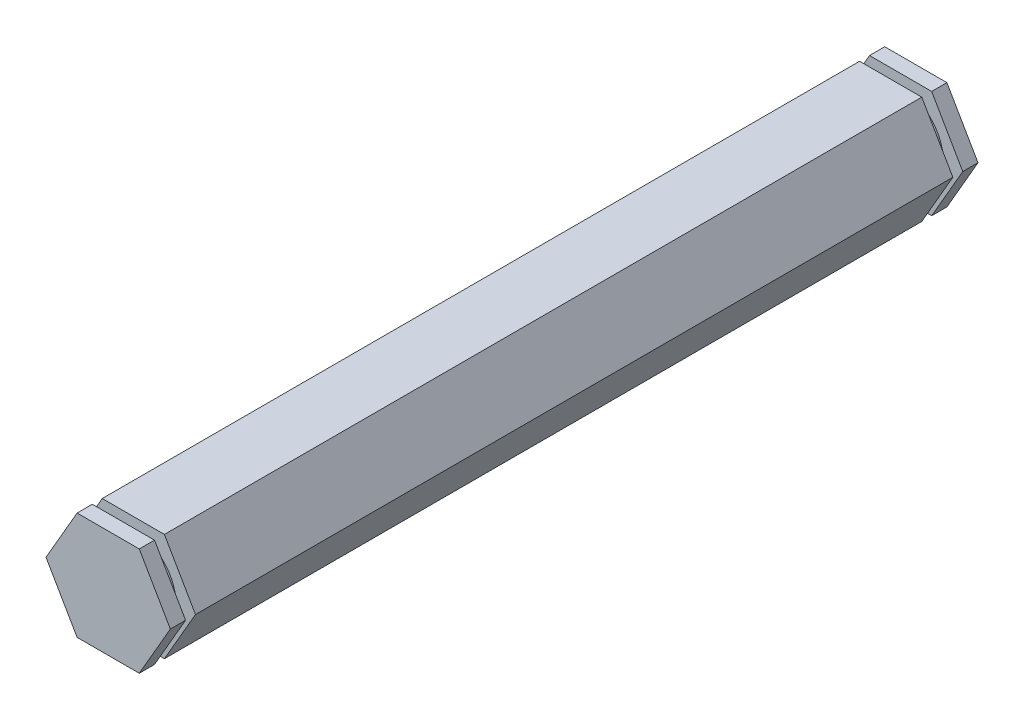
ISO-10303-21;
HEADER;
FILE_DESCRIPTION(('STEP AP214'),'2;1');
FILE_NAME('part.step','',(''),(''),'','','');
FILE_SCHEMA(('AUTOMOTIVE_DESIGN { 1 0 10303 214 1 1 1 1 }'));
ENDSEC;
DATA;
#1=APPLICATION_CONTEXT('core data for automotive mechanical design processes');
#2=APPLICATION_PROTOCOL_DEFINITION('international standard','automotive_design',2000,#1);
#3=PRODUCT_CONTEXT('',#1,'mechanical');
#4=PRODUCT('Part','Part','',(#3));
#5=PRODUCT_RELATED_PRODUCT_CATEGORY('part','',(#4));
#6=PRODUCT_DEFINITION_FORMATION('','',#4);
#7=PRODUCT_DEFINITION_CONTEXT('part definition',#1,'design');
#8=PRODUCT_DEFINITION('design','',#6,#7);
#9=PRODUCT_DEFINITION_SHAPE('','',#8);
#10=(LENGTH_UNIT() NAMED_UNIT(*) SI_UNIT(.MILLI.,.METRE.));
#11=(NAMED_UNIT(*) PLANE_ANGLE_UNIT() SI_UNIT($,.RADIAN.));
#12=(NAMED_UNIT(*) SI_UNIT($,.STERADIAN.) SOLID_ANGLE_UNIT());
#13=UNCERTAINTY_MEASURE_WITH_UNIT(LENGTH_MEASURE(1.E-05),#10,'distance_accuracy_value','');
#14=(GEOMETRIC_REPRESENTATION_CONTEXT(3) GLOBAL_UNCERTAINTY_ASSIGNED_CONTEXT((#13)) GLOBAL_UNIT_ASSIGNED_CONTEXT((#10,
#11,#12)) REPRESENTATION_CONTEXT('',''));
#15=CARTESIAN_POINT('',(0.,0.,0.));
#16=DIRECTION('',(0.,0.,1.));
#17=DIRECTION('',(1.,0.,0.));
#18=AXIS2_PLACEMENT_3D('',#15,#16,#17);
#19=CARTESIAN_POINT('',(3.66617420935412,6.35,47.625));
#20=DIRECTION('',(0.,-1.,0.));
#21=DIRECTION('',(0.,0.,-1.));
#22=AXIS2_PLACEMENT_3D('',#19,#20,#21);
#23=PLANE('',#22);
#24=DIRECTION('',(0.,0.,-1.));
#25=VECTOR('',#24,1.);
#26=CARTESIAN_POINT('',(3.66617420935412,6.35,47.625));
#27=LINE('',#26,#25);
#28=CARTESIAN_POINT('',(3.66617420935412,6.35,47.625));
#29=VERTEX_POINT('',#28);
#30=CARTESIAN_POINT('',(3.66617420935412,6.35,45.82795));
#31=VERTEX_POINT('',#30);
#32=EDGE_CURVE('E178',#29,#31,#27,.T.);
#33=ORIENTED_EDGE('',*,*,#32,.T.);
#34=DIRECTION('',(-1.,0.,0.));
#35=VECTOR('',#34,1.);
#36=CARTESIAN_POINT('',(3.66617420935412,6.35,45.82795));
#37=LINE('',#36,#35);
#38=CARTESIAN_POINT('',(-3.66617420935412,6.35,45.82795));
#39=VERTEX_POINT('',#38);
#40=EDGE_CURVE('E225',#31,#39,#37,.T.);
#41=ORIENTED_EDGE('',*,*,#40,.T.);
#42=DIRECTION('',(0.,0.,-1.));
#43=VECTOR('',#42,1.);
#44=CARTESIAN_POINT('',(-3.66617420935412,6.35,47.625));
#45=LINE('',#44,#43);
#46=CARTESIAN_POINT('',(-3.66617420935412,6.35,47.625));
#47=VERTEX_POINT('',#46);
#48=EDGE_CURVE('E207',#47,#39,#45,.T.);
#49=ORIENTED_EDGE('',*,*,#48,.F.);
#50=DIRECTION('',(-1.,0.,0.));
#51=VECTOR('',#50,1.);
#52=CARTESIAN_POINT('',(3.66617420935412,6.35,47.625));
#53=LINE('',#52,#51);
#54=EDGE_CURVE('E227',#29,#47,#53,.T.);
#55=ORIENTED_EDGE('',*,*,#54,.F.);
#56=EDGE_LOOP('',(#33,#41,#49,#55));
#57=FACE_BOUND('',#56,.T.);
#58=ADVANCED_FACE('F35',(#57),#23,.F.);
#59=CARTESIAN_POINT('',(-3.66617420935412,6.35,47.625));
#60=DIRECTION('',(0.866025403784439,-0.499999999999999,0.));
#61=DIRECTION('',(0.499999999999999,0.866025403784439,0.));
#62=AXIS2_PLACEMENT_3D('',#59,#60,#61);
#63=PLANE('',#62);
#64=ORIENTED_EDGE('',*,*,#48,.T.);
#65=DIRECTION('',(-0.499999999999999,-0.866025403784439,0.));
#66=VECTOR('',#65,1.);
#67=CARTESIAN_POINT('',(-3.66617420935412,6.35,45.82795));
#68=LINE('',#67,#66);
#69=CARTESIAN_POINT('',(-7.33234841870824,0.,45.82795));
#70=VERTEX_POINT('',#69);
#71=EDGE_CURVE('E303',#39,#70,#68,.T.);
#72=ORIENTED_EDGE('',*,*,#71,.T.);
#73=DIRECTION('',(0.,0.,-1.));
#74=VECTOR('',#73,1.);
#75=CARTESIAN_POINT('',(-7.33234841870824,0.,47.625));
#76=LINE('',#75,#74);
#77=CARTESIAN_POINT('',(-7.33234841870824,0.,47.625));
#78=VERTEX_POINT('',#77);
#79=EDGE_CURVE('E202',#78,#70,#76,.T.);
#80=ORIENTED_EDGE('',*,*,#79,.F.);
#81=DIRECTION('',(-0.499999999999999,-0.866025403784439,0.));
#82=VECTOR('',#81,1.);
#83=CARTESIAN_POINT('',(-3.66617420935412,6.35,47.625));
#84=LINE('',#83,#82);
#85=EDGE_CURVE('E229',#47,#78,#84,.T.);
#86=ORIENTED_EDGE('',*,*,#85,.F.);
#87=EDGE_LOOP('',(#64,#72,#80,#86));
#88=FACE_BOUND('',#87,.T.);
#89=ADVANCED_FACE('F307',(#88),#63,.F.);
#90=CARTESIAN_POINT('',(-7.33234841870824,0.,47.625));
#91=DIRECTION('',(0.866025403784438,0.5,0.));
#92=DIRECTION('',(-0.5,0.866025403784438,0.));
#93=AXIS2_PLACEMENT_3D('',#90,#91,#92);
#94=PLANE('',#93);
#95=ORIENTED_EDGE('',*,*,#79,.T.);
#96=DIRECTION('',(0.5,-0.866025403784438,0.));
#97=VECTOR('',#96,1.);
#98=CARTESIAN_POINT('',(-7.33234841870824,0.,45.82795));
#99=LINE('',#98,#97);
#100=CARTESIAN_POINT('',(-3.66617420935412,-6.35,45.82795));
#101=VERTEX_POINT('',#100);
#102=EDGE_CURVE('E301',#70,#101,#99,.T.);
#103=ORIENTED_EDGE('',*,*,#102,.T.);
#104=DIRECTION('',(0.,0.,-1.));
#105=VECTOR('',#104,1.);
#106=CARTESIAN_POINT('',(-3.66617420935412,-6.35,47.625));
#107=LINE('',#106,#105);
#108=CARTESIAN_POINT('',(-3.66617420935412,-6.35,47.625));
#109=VERTEX_POINT('',#108);
#110=EDGE_CURVE('E197',#109,#101,#107,.T.);
#111=ORIENTED_EDGE('',*,*,#110,.F.);
#112=DIRECTION('',(0.5,-0.866025403784438,0.));
#113=VECTOR('',#112,1.);
#114=CARTESIAN_POINT('',(-7.33234841870824,0.,47.625));
#115=LINE('',#114,#113);
#116=EDGE_CURVE('E231',#78,#109,#115,.T.);
#117=ORIENTED_EDGE('',*,*,#116,.F.);
#118=EDGE_LOOP('',(#95,#103,#111,#117));
#119=FACE_BOUND('',#118,.T.);
#120=ADVANCED_FACE('F310',(#119),#94,.F.);
#121=CARTESIAN_POINT('',(-3.66617420935412,-6.35,47.625));
#122=DIRECTION('',(0.,1.,0.));
#123=DIRECTION('',(-1.,0.,0.));
#124=AXIS2_PLACEMENT_3D('',#121,#122,#123);
#125=PLANE('',#124);
#126=ORIENTED_EDGE('',*,*,#110,.T.);
#127=DIRECTION('',(1.,0.,0.));
#128=VECTOR('',#127,1.);
#129=CARTESIAN_POINT('',(-3.66617420935412,-6.35,45.82795));
#130=LINE('',#129,#128);
#131=CARTESIAN_POINT('',(3.66617420935412,-6.35,45.82795));
#132=VERTEX_POINT('',#131);
#133=EDGE_CURVE('E298',#101,#132,#130,.T.);
#134=ORIENTED_EDGE('',*,*,#133,.T.);
#135=DIRECTION('',(0.,0.,-1.));
#136=VECTOR('',#135,1.);
#137=CARTESIAN_POINT('',(3.66617420935412,-6.35,47.625));
#138=LINE('',#137,#136);
#139=CARTESIAN_POINT('',(3.66617420935412,-6.35,47.625));
#140=VERTEX_POINT('',#139);
#141=EDGE_CURVE('E192',#140,#132,#138,.T.);
#142=ORIENTED_EDGE('',*,*,#141,.F.);
#143=DIRECTION('',(1.,0.,0.));
#144=VECTOR('',#143,1.);
#145=CARTESIAN_POINT('',(-3.66617420935412,-6.35,47.625));
#146=LINE('',#145,#144);
#147=EDGE_CURVE('E239',#109,#140,#146,.T.);
#148=ORIENTED_EDGE('',*,*,#147,.F.);
#149=EDGE_LOOP('',(#126,#134,#142,#148));
#150=FACE_BOUND('',#149,.T.);
#151=ADVANCED_FACE('F317',(#150),#125,.F.);
#152=CARTESIAN_POINT('',(3.66617420935412,-6.35,47.625));
#153=DIRECTION('',(-0.866025403784439,0.5,0.));
#154=DIRECTION('',(-0.5,-0.866025403784439,0.));
#155=AXIS2_PLACEMENT_3D('',#152,#153,#154);
#156=PLANE('',#155);
#157=ORIENTED_EDGE('',*,*,#141,.T.);
#158=DIRECTION('',(0.5,0.866025403784439,0.));
#159=VECTOR('',#158,1.);
#160=CARTESIAN_POINT('',(3.66617420935412,-6.35,45.82795));
#161=LINE('',#160,#159);
#162=CARTESIAN_POINT('',(7.33234841870825,0.,45.82795));
#163=VERTEX_POINT('',#162);
#164=EDGE_CURVE('E296',#132,#163,#161,.T.);
#165=ORIENTED_EDGE('',*,*,#164,.T.);
#166=DIRECTION('',(0.,0.,-1.));
#167=VECTOR('',#166,1.);
#168=CARTESIAN_POINT('',(7.33234841870825,0.,47.625));
#169=LINE('',#168,#167);
#170=CARTESIAN_POINT('',(7.33234841870825,0.,47.625));
#171=VERTEX_POINT('',#170);
#172=EDGE_CURVE('E188',#171,#163,#169,.T.);
#173=ORIENTED_EDGE('',*,*,#172,.F.);
#174=DIRECTION('',(0.5,0.866025403784439,0.));
#175=VECTOR('',#174,1.);
#176=CARTESIAN_POINT('',(3.66617420935412,-6.35,47.625));
#177=LINE('',#176,#175);
#178=EDGE_CURVE('E241',#140,#171,#177,.T.);
#179=ORIENTED_EDGE('',*,*,#178,.F.);
#180=EDGE_LOOP('',(#157,#165,#173,#179));
#181=FACE_BOUND('',#180,.T.);
#182=ADVANCED_FACE('F319',(#181),#156,.F.);
#183=CARTESIAN_POINT('',(7.33234841870825,0.,47.625));
#184=DIRECTION('',(-0.866025403784438,-0.5,0.));
#185=DIRECTION('',(0.5,-0.866025403784438,0.));
#186=AXIS2_PLACEMENT_3D('',#183,#184,#185);
#187=PLANE('',#186);
#188=ORIENTED_EDGE('',*,*,#172,.T.);
#189=DIRECTION('',(-0.5,0.866025403784438,0.));
#190=VECTOR('',#189,1.);
#191=CARTESIAN_POINT('',(7.33234841870825,0.,45.82795));
#192=LINE('',#191,#190);
#193=EDGE_CURVE('E164',#163,#31,#192,.T.);
#194=ORIENTED_EDGE('',*,*,#193,.T.);
#195=ORIENTED_EDGE('',*,*,#32,.F.);
#196=DIRECTION('',(-0.5,0.866025403784438,0.));
#197=VECTOR('',#196,1.);
#198=CARTESIAN_POINT('',(7.33234841870825,0.,47.625));
#199=LINE('',#198,#197);
#200=EDGE_CURVE('E183',#171,#29,#199,.T.);
#201=ORIENTED_EDGE('',*,*,#200,.F.);
#202=EDGE_LOOP('',(#188,#194,#195,#201));
#203=FACE_BOUND('',#202,.T.);
#204=ADVANCED_FACE('F216',(#203),#187,.F.);
#205=CARTESIAN_POINT('',(0.,0.,47.625));
#206=DIRECTION('',(0.,0.,1.));
#207=DIRECTION('',(1.,0.,0.));
#208=AXIS2_PLACEMENT_3D('',#205,#206,#207);
#209=PLANE('',#208);
#210=ORIENTED_EDGE('',*,*,#54,.T.);
#211=ORIENTED_EDGE('',*,*,#85,.T.);
#212=ORIENTED_EDGE('',*,*,#116,.T.);
#213=ORIENTED_EDGE('',*,*,#147,.T.);
#214=ORIENTED_EDGE('',*,*,#178,.T.);
#215=ORIENTED_EDGE('',*,*,#200,.T.);
#216=EDGE_LOOP('',(#210,#211,#212,#213,#214,#215));
#217=FACE_BOUND('',#216,.T.);
#218=ADVANCED_FACE('F313',(#217),#209,.T.);
#219=CARTESIAN_POINT('',(0.,7.76239261253806,45.82795));
#220=DIRECTION('',(0.,0.,1.));
#221=DIRECTION('',(0.,-1.,0.));
#222=AXIS2_PLACEMENT_3D('',#219,#220,#221);
#223=PLANE('',#222);
#224=CARTESIAN_POINT('',(0.,0.,45.82795));
#225=DIRECTION('',(0.,0.,-1.));
#226=DIRECTION('',(0.,1.,0.));
#227=AXIS2_PLACEMENT_3D('',#224,#225,#226);
#228=CIRCLE('',#227,5.02919999999998);
#229=CARTESIAN_POINT('',(0.,5.0292,45.82795));
#230=VERTEX_POINT('',#229);
#231=EDGE_CURVE('E275',#230,#230,#228,.T.);
#232=ORIENTED_EDGE('',*,*,#231,.F.);
#233=EDGE_LOOP('',(#232));
#234=FACE_BOUND('',#233,.T.);
#235=ORIENTED_EDGE('',*,*,#193,.F.);
#236=ORIENTED_EDGE('',*,*,#164,.F.);
#237=ORIENTED_EDGE('',*,*,#133,.F.);
#238=ORIENTED_EDGE('',*,*,#102,.F.);
#239=ORIENTED_EDGE('',*,*,#71,.F.);
#240=ORIENTED_EDGE('',*,*,#40,.F.);
#241=EDGE_LOOP('',(#235,#236,#237,#238,#239,#240));
#242=FACE_BOUND('',#241,.T.);
#243=ADVANCED_FACE('F320',(#234,#242),#223,.F.);
#244=CARTESIAN_POINT('',(0.,5.0292,44.65955));
#245=DIRECTION('',(0.,0.,-1.));
#246=DIRECTION('',(0.,1.,0.));
#247=AXIS2_PLACEMENT_3D('',#244,#245,#246);
#248=PLANE('',#247);
#249=CARTESIAN_POINT('',(0.,0.,44.65955));
#250=DIRECTION('',(0.,0.,-1.));
#251=DIRECTION('',(0.,1.,0.));
#252=AXIS2_PLACEMENT_3D('',#249,#250,#251);
#253=CIRCLE('',#252,5.02919999999998);
#254=CARTESIAN_POINT('',(0.,5.0292,44.65955));
#255=VERTEX_POINT('',#254);
#256=EDGE_CURVE('E271',#255,#255,#253,.T.);
#257=ORIENTED_EDGE('',*,*,#256,.T.);
#258=EDGE_LOOP('',(#257));
#259=FACE_BOUND('',#258,.T.);
#260=DIRECTION('',(0.499999999999999,0.866025403784439,0.));
#261=VECTOR('',#260,1.);
#262=CARTESIAN_POINT('',(-3.66617420935412,6.35,44.65955));
#263=LINE('',#262,#261);
#264=CARTESIAN_POINT('',(-7.33234841870824,0.,44.65955));
#265=VERTEX_POINT('',#264);
#266=CARTESIAN_POINT('',(-3.66617420935412,6.35,44.65955));
#267=VERTEX_POINT('',#266);
#268=EDGE_CURVE('E292',#265,#267,#263,.T.);
#269=ORIENTED_EDGE('',*,*,#268,.F.);
#270=DIRECTION('',(-0.5,0.866025403784438,0.));
#271=VECTOR('',#270,1.);
#272=CARTESIAN_POINT('',(-7.33234841870824,0.,44.65955));
#273=LINE('',#272,#271);
#274=CARTESIAN_POINT('',(-3.66617420935412,-6.35,44.65955));
#275=VERTEX_POINT('',#274);
#276=EDGE_CURVE('E289',#275,#265,#273,.T.);
#277=ORIENTED_EDGE('',*,*,#276,.F.);
#278=DIRECTION('',(-1.,0.,0.));
#279=VECTOR('',#278,1.);
#280=CARTESIAN_POINT('',(-3.66617420935412,-6.35,44.65955));
#281=LINE('',#280,#279);
#282=CARTESIAN_POINT('',(3.66617420935412,-6.35,44.65955));
#283=VERTEX_POINT('',#282);
#284=EDGE_CURVE('E286',#283,#275,#281,.T.);
#285=ORIENTED_EDGE('',*,*,#284,.F.);
#286=DIRECTION('',(-0.5,-0.866025403784439,0.));
#287=VECTOR('',#286,1.);
#288=CARTESIAN_POINT('',(3.66617420935412,-6.35,44.65955));
#289=LINE('',#288,#287);
#290=CARTESIAN_POINT('',(7.33234841870825,0.,44.65955));
#291=VERTEX_POINT('',#290);
#292=EDGE_CURVE('E283',#291,#283,#289,.T.);
#293=ORIENTED_EDGE('',*,*,#292,.F.);
#294=DIRECTION('',(0.5,-0.866025403784438,0.));
#295=VECTOR('',#294,1.);
#296=CARTESIAN_POINT('',(7.33234841870825,0.,44.65955));
#297=LINE('',#296,#295);
#298=CARTESIAN_POINT('',(3.66617420935412,6.35,44.65955));
#299=VERTEX_POINT('',#298);
#300=EDGE_CURVE('E210',#299,#291,#297,.T.);
#301=ORIENTED_EDGE('',*,*,#300,.F.);
#302=DIRECTION('',(1.,0.,0.));
#303=VECTOR('',#302,1.);
#304=CARTESIAN_POINT('',(3.66617420935412,6.35,44.65955));
#305=LINE('',#304,#303);
#306=EDGE_CURVE('E177',#267,#299,#305,.T.);
#307=ORIENTED_EDGE('',*,*,#306,.F.);
#308=EDGE_LOOP('',(#269,#277,#285,#293,#301,#307));
#309=FACE_BOUND('',#308,.T.);
#310=ADVANCED_FACE('F322',(#259,#309),#248,.F.);
#311=CARTESIAN_POINT('',(0.,0.,0.));
#312=DIRECTION('',(0.,0.,-1.));
#313=DIRECTION('',(0.,1.,0.));
#314=AXIS2_PLACEMENT_3D('',#311,#312,#313);
#315=CYLINDRICAL_SURFACE('',#314,5.02919999999998);
#316=ORIENTED_EDGE('',*,*,#256,.F.);
#317=EDGE_LOOP('',(#316));
#318=FACE_BOUND('',#317,.T.);
#319=ORIENTED_EDGE('',*,*,#231,.T.);
#320=EDGE_LOOP('',(#319));
#321=FACE_BOUND('',#320,.T.);
#322=ADVANCED_FACE('F329',(#318,#321),#315,.T.);
#323=CARTESIAN_POINT('',(7.33234841870825,0.,-44.65955));
#324=VERTEX_POINT('',#323);
#325=EDGE_CURVE('E172',#291,#324,#169,.T.);
#326=ORIENTED_EDGE('',*,*,#325,.T.);
#327=DIRECTION('',(-0.5,0.866025403784438,0.));
#328=VECTOR('',#327,1.);
#329=CARTESIAN_POINT('',(7.33234841870823,0.,-44.65955));
#330=LINE('',#329,#328);
#331=CARTESIAN_POINT('',(3.66617420935412,6.35,-44.65955));
#332=VERTEX_POINT('',#331);
#333=EDGE_CURVE('E158',#324,#332,#330,.T.);
#334=ORIENTED_EDGE('',*,*,#333,.T.);
#335=EDGE_CURVE('E170',#299,#332,#27,.T.);
#336=ORIENTED_EDGE('',*,*,#335,.F.);
#337=ORIENTED_EDGE('',*,*,#300,.T.);
#338=EDGE_LOOP('',(#326,#334,#336,#337));
#339=FACE_BOUND('',#338,.T.);
#340=ADVANCED_FACE('F168',(#339),#187,.F.);
#341=CARTESIAN_POINT('',(3.66617420935412,-6.35,-44.65955));
#342=VERTEX_POINT('',#341);
#343=EDGE_CURVE('E196',#283,#342,#138,.T.);
#344=ORIENTED_EDGE('',*,*,#343,.T.);
#345=DIRECTION('',(0.5,0.866025403784439,0.));
#346=VECTOR('',#345,1.);
#347=CARTESIAN_POINT('',(3.66617420935414,-6.34999999999998,-44.65955));
#348=LINE('',#347,#346);
#349=EDGE_CURVE('E174',#342,#324,#348,.T.);
#350=ORIENTED_EDGE('',*,*,#349,.T.);
#351=ORIENTED_EDGE('',*,*,#325,.F.);
#352=ORIENTED_EDGE('',*,*,#292,.T.);
#353=EDGE_LOOP('',(#344,#350,#351,#352));
#354=FACE_BOUND('',#353,.T.);
#355=ADVANCED_FACE('F408',(#354),#156,.F.);
#356=CARTESIAN_POINT('',(-3.66617420935412,-6.35,-44.65955));
#357=VERTEX_POINT('',#356);
#358=EDGE_CURVE('E201',#275,#357,#107,.T.);
#359=ORIENTED_EDGE('',*,*,#358,.T.);
#360=DIRECTION('',(1.,0.,0.));
#361=VECTOR('',#360,1.);
#362=CARTESIAN_POINT('',(-3.66617420935412,-6.35,-44.65955));
#363=LINE('',#362,#361);
#364=EDGE_CURVE('E381',#357,#342,#363,.T.);
#365=ORIENTED_EDGE('',*,*,#364,.T.);
#366=ORIENTED_EDGE('',*,*,#343,.F.);
#367=ORIENTED_EDGE('',*,*,#284,.T.);
#368=EDGE_LOOP('',(#359,#365,#366,#367));
#369=FACE_BOUND('',#368,.T.);
#370=ADVANCED_FACE('F415',(#369),#125,.F.);
#371=CARTESIAN_POINT('',(-7.33234841870824,0.,-44.65955));
#372=VERTEX_POINT('',#371);
#373=EDGE_CURVE('E206',#265,#372,#76,.T.);
#374=ORIENTED_EDGE('',*,*,#373,.T.);
#375=DIRECTION('',(0.5,-0.866025403784438,0.));
#376=VECTOR('',#375,1.);
#377=CARTESIAN_POINT('',(-7.33234841870826,0.,-44.65955));
#378=LINE('',#377,#376);
#379=EDGE_CURVE('E365',#372,#357,#378,.T.);
#380=ORIENTED_EDGE('',*,*,#379,.T.);
#381=ORIENTED_EDGE('',*,*,#358,.F.);
#382=ORIENTED_EDGE('',*,*,#276,.T.);
#383=EDGE_LOOP('',(#374,#380,#381,#382));
#384=FACE_BOUND('',#383,.T.);
#385=ADVANCED_FACE('F362',(#384),#94,.F.);
#386=CARTESIAN_POINT('',(-3.66617420935412,6.35,-44.65955));
#387=VERTEX_POINT('',#386);
#388=EDGE_CURVE('E211',#267,#387,#45,.T.);
#389=ORIENTED_EDGE('',*,*,#388,.T.);
#390=DIRECTION('',(-0.499999999999999,-0.866025403784439,0.));
#391=VECTOR('',#390,1.);
#392=CARTESIAN_POINT('',(-3.66617420935411,6.35000000000002,-44.65955));
#393=LINE('',#392,#391);
#394=EDGE_CURVE('E57',#387,#372,#393,.T.);
#395=ORIENTED_EDGE('',*,*,#394,.T.);
#396=ORIENTED_EDGE('',*,*,#373,.F.);
#397=ORIENTED_EDGE('',*,*,#268,.T.);
#398=EDGE_LOOP('',(#389,#395,#396,#397));
#399=FACE_BOUND('',#398,.T.);
#400=ADVANCED_FACE('F340',(#399),#63,.F.);
#401=ORIENTED_EDGE('',*,*,#335,.T.);
#402=DIRECTION('',(-1.,0.,0.));
#403=VECTOR('',#402,1.);
#404=CARTESIAN_POINT('',(3.66617420935412,6.35,-44.65955));
#405=LINE('',#404,#403);
#406=EDGE_CURVE('E43',#332,#387,#405,.T.);
#407=ORIENTED_EDGE('',*,*,#406,.T.);
#408=ORIENTED_EDGE('',*,*,#388,.F.);
#409=ORIENTED_EDGE('',*,*,#306,.T.);
#410=EDGE_LOOP('',(#401,#407,#408,#409));
#411=FACE_BOUND('',#410,.T.);
#412=ADVANCED_FACE('F37',(#411),#23,.F.);
#413=CARTESIAN_POINT('',(0.,7.76239261253806,-45.82795));
#414=DIRECTION('',(0.,0.,-1.));
#415=DIRECTION('',(0.,-1.,0.));
#416=AXIS2_PLACEMENT_3D('',#413,#414,#415);
#417=PLANE('',#416);
#418=CARTESIAN_POINT('',(0.,0.,-45.82795));
#419=DIRECTION('',(0.,0.,-1.));
#420=DIRECTION('',(0.,1.,0.));
#421=AXIS2_PLACEMENT_3D('',#418,#419,#420);
#422=CIRCLE('',#421,5.02919999999998);
#423=CARTESIAN_POINT('',(0.,5.0292,-45.82795));
#424=VERTEX_POINT('',#423);
#425=EDGE_CURVE('E385',#424,#424,#422,.T.);
#426=ORIENTED_EDGE('',*,*,#425,.T.);
#427=EDGE_LOOP('',(#426));
#428=FACE_BOUND('',#427,.T.);
#429=DIRECTION('',(1.,0.,0.));
#430=VECTOR('',#429,1.);
#431=CARTESIAN_POINT('',(3.66617420935412,6.35,-45.82795));
#432=LINE('',#431,#430);
#433=CARTESIAN_POINT('',(-3.66617420935412,6.35,-45.82795));
#434=VERTEX_POINT('',#433);
#435=CARTESIAN_POINT('',(3.66617420935412,6.35,-45.82795));
#436=VERTEX_POINT('',#435);
#437=EDGE_CURVE('E11',#434,#436,#432,.T.);
#438=ORIENTED_EDGE('',*,*,#437,.F.);
#439=DIRECTION('',(0.499999999999999,0.866025403784439,0.));
#440=VECTOR('',#439,1.);
#441=CARTESIAN_POINT('',(-3.66617420935411,6.35000000000002,-45.82795));
#442=LINE('',#441,#440);
#443=CARTESIAN_POINT('',(-7.33234841870824,0.,-45.82795));
#444=VERTEX_POINT('',#443);
#445=EDGE_CURVE('E173',#444,#434,#442,.T.);
#446=ORIENTED_EDGE('',*,*,#445,.F.);
#447=DIRECTION('',(-0.5,0.866025403784438,0.));
#448=VECTOR('',#447,1.);
#449=CARTESIAN_POINT('',(-7.33234841870826,0.,-45.82795));
#450=LINE('',#449,#448);
#451=CARTESIAN_POINT('',(-3.66617420935412,-6.35,-45.82795));
#452=VERTEX_POINT('',#451);
#453=EDGE_CURVE('E376',#452,#444,#450,.T.);
#454=ORIENTED_EDGE('',*,*,#453,.F.);
#455=DIRECTION('',(-1.,0.,0.));
#456=VECTOR('',#455,1.);
#457=CARTESIAN_POINT('',(-3.66617420935412,-6.35,-45.82795));
#458=LINE('',#457,#456);
#459=CARTESIAN_POINT('',(3.66617420935412,-6.35,-45.82795));
#460=VERTEX_POINT('',#459);
#461=EDGE_CURVE('E277',#460,#452,#458,.T.);
#462=ORIENTED_EDGE('',*,*,#461,.F.);
#463=DIRECTION('',(-0.5,-0.866025403784439,0.));
#464=VECTOR('',#463,1.);
#465=CARTESIAN_POINT('',(3.66617420935414,-6.34999999999998,-45.82795));
#466=LINE('',#465,#464);
#467=CARTESIAN_POINT('',(7.33234841870825,0.,-45.82795));
#468=VERTEX_POINT('',#467);
#469=EDGE_CURVE('E272',#468,#460,#466,.T.);
#470=ORIENTED_EDGE('',*,*,#469,.F.);
#471=DIRECTION('',(0.5,-0.866025403784438,0.));
#472=VECTOR('',#471,1.);
#473=CARTESIAN_POINT('',(7.33234841870823,0.,-45.82795));
#474=LINE('',#473,#472);
#475=EDGE_CURVE('E50',#436,#468,#474,.T.);
#476=ORIENTED_EDGE('',*,*,#475,.F.);
#477=EDGE_LOOP('',(#438,#446,#454,#462,#470,#476));
#478=FACE_BOUND('',#477,.T.);
#479=ADVANCED_FACE('F343',(#428,#478),#417,.F.);
#480=CARTESIAN_POINT('',(0.,5.0292,-44.65955));
#481=DIRECTION('',(0.,0.,1.));
#482=DIRECTION('',(0.,1.,0.));
#483=AXIS2_PLACEMENT_3D('',#480,#481,#482);
#484=PLANE('',#483);
#485=CARTESIAN_POINT('',(0.,0.,-44.65955));
#486=DIRECTION('',(0.,0.,-1.));
#487=DIRECTION('',(0.,1.,0.));
#488=AXIS2_PLACEMENT_3D('',#485,#486,#487);
#489=CIRCLE('',#488,5.02919999999998);
#490=CARTESIAN_POINT('',(0.,5.0292,-44.65955));
#491=VERTEX_POINT('',#490);
#492=EDGE_CURVE('E388',#491,#491,#489,.T.);
#493=ORIENTED_EDGE('',*,*,#492,.F.);
#494=EDGE_LOOP('',(#493));
#495=FACE_BOUND('',#494,.T.);
#496=ORIENTED_EDGE('',*,*,#349,.F.);
#497=ORIENTED_EDGE('',*,*,#364,.F.);
#498=ORIENTED_EDGE('',*,*,#379,.F.);
#499=ORIENTED_EDGE('',*,*,#394,.F.);
#500=ORIENTED_EDGE('',*,*,#406,.F.);
#501=ORIENTED_EDGE('',*,*,#333,.F.);
#502=EDGE_LOOP('',(#496,#497,#498,#499,#500,#501));
#503=FACE_BOUND('',#502,.T.);
#504=ADVANCED_FACE('F157',(#495,#503),#484,.F.);
#505=CARTESIAN_POINT('',(0.,0.,0.));
#506=DIRECTION('',(0.,0.,1.));
#507=DIRECTION('',(0.,1.,0.));
#508=AXIS2_PLACEMENT_3D('',#505,#506,#507);
#509=CYLINDRICAL_SURFACE('',#508,5.02919999999998);
#510=ORIENTED_EDGE('',*,*,#492,.T.);
#511=EDGE_LOOP('',(#510));
#512=FACE_BOUND('',#511,.T.);
#513=ORIENTED_EDGE('',*,*,#425,.F.);
#514=EDGE_LOOP('',(#513));
#515=FACE_BOUND('',#514,.T.);
#516=ADVANCED_FACE('F352',(#512,#515),#509,.T.);
#517=CARTESIAN_POINT('',(0.,0.,-47.625));
#518=DIRECTION('',(0.,0.,1.));
#519=DIRECTION('',(1.,0.,0.));
#520=AXIS2_PLACEMENT_3D('',#517,#518,#519);
#521=PLANE('',#520);
#522=DIRECTION('',(-1.,0.,0.));
#523=VECTOR('',#522,1.);
#524=CARTESIAN_POINT('',(3.66617420935412,6.35,-47.625));
#525=LINE('',#524,#523);
#526=CARTESIAN_POINT('',(3.66617420935412,6.35,-47.625));
#527=VERTEX_POINT('',#526);
#528=CARTESIAN_POINT('',(-3.66617420935412,6.35,-47.625));
#529=VERTEX_POINT('',#528);
#530=EDGE_CURVE('E244',#527,#529,#525,.T.);
#531=ORIENTED_EDGE('',*,*,#530,.F.);
#532=DIRECTION('',(-0.5,0.866025403784438,0.));
#533=VECTOR('',#532,1.);
#534=CARTESIAN_POINT('',(7.33234841870825,0.,-47.625));
#535=LINE('',#534,#533);
#536=CARTESIAN_POINT('',(7.33234841870825,0.,-47.625));
#537=VERTEX_POINT('',#536);
#538=EDGE_CURVE('E186',#537,#527,#535,.T.);
#539=ORIENTED_EDGE('',*,*,#538,.F.);
#540=DIRECTION('',(0.5,0.866025403784439,0.));
#541=VECTOR('',#540,1.);
#542=CARTESIAN_POINT('',(3.66617420935412,-6.35,-47.625));
#543=LINE('',#542,#541);
#544=CARTESIAN_POINT('',(3.66617420935412,-6.35,-47.625));
#545=VERTEX_POINT('',#544);
#546=EDGE_CURVE('E234',#545,#537,#543,.T.);
#547=ORIENTED_EDGE('',*,*,#546,.F.);
#548=DIRECTION('',(1.,0.,0.));
#549=VECTOR('',#548,1.);
#550=CARTESIAN_POINT('',(-3.66617420935412,-6.35,-47.625));
#551=LINE('',#550,#549);
#552=CARTESIAN_POINT('',(-3.66617420935412,-6.35,-47.625));
#553=VERTEX_POINT('',#552);
#554=EDGE_CURVE('E253',#553,#545,#551,.T.);
#555=ORIENTED_EDGE('',*,*,#554,.F.);
#556=DIRECTION('',(0.5,-0.866025403784438,0.));
#557=VECTOR('',#556,1.);
#558=CARTESIAN_POINT('',(-7.33234841870824,0.,-47.625));
#559=LINE('',#558,#557);
#560=CARTESIAN_POINT('',(-7.33234841870824,0.,-47.625));
#561=VERTEX_POINT('',#560);
#562=EDGE_CURVE('E250',#561,#553,#559,.T.);
#563=ORIENTED_EDGE('',*,*,#562,.F.);
#564=DIRECTION('',(-0.499999999999999,-0.866025403784439,0.));
#565=VECTOR('',#564,1.);
#566=CARTESIAN_POINT('',(-3.66617420935412,6.35,-47.625));
#567=LINE('',#566,#565);
#568=EDGE_CURVE('E247',#529,#561,#567,.T.);
#569=ORIENTED_EDGE('',*,*,#568,.F.);
#570=EDGE_LOOP('',(#531,#539,#547,#555,#563,#569));
#571=FACE_BOUND('',#570,.T.);
#572=ADVANCED_FACE('F266',(#571),#521,.F.);
#573=EDGE_CURVE('E205',#434,#529,#45,.T.);
#574=ORIENTED_EDGE('',*,*,#573,.F.);
#575=ORIENTED_EDGE('',*,*,#437,.T.);
#576=EDGE_CURVE('E179',#436,#527,#27,.T.);
#577=ORIENTED_EDGE('',*,*,#576,.T.);
#578=ORIENTED_EDGE('',*,*,#530,.T.);
#579=EDGE_LOOP('',(#574,#575,#577,#578));
#580=FACE_BOUND('',#579,.T.);
#581=ADVANCED_FACE('F336',(#580),#23,.F.);
#582=EDGE_CURVE('E200',#444,#561,#76,.T.);
#583=ORIENTED_EDGE('',*,*,#582,.F.);
#584=ORIENTED_EDGE('',*,*,#445,.T.);
#585=ORIENTED_EDGE('',*,*,#573,.T.);
#586=ORIENTED_EDGE('',*,*,#568,.T.);
#587=EDGE_LOOP('',(#583,#584,#585,#586));
#588=FACE_BOUND('',#587,.T.);
#589=ADVANCED_FACE('F341',(#588),#63,.F.);
#590=EDGE_CURVE('E195',#452,#553,#107,.T.);
#591=ORIENTED_EDGE('',*,*,#590,.F.);
#592=ORIENTED_EDGE('',*,*,#453,.T.);
#593=ORIENTED_EDGE('',*,*,#582,.T.);
#594=ORIENTED_EDGE('',*,*,#562,.T.);
#595=EDGE_LOOP('',(#591,#592,#593,#594));
#596=FACE_BOUND('',#595,.T.);
#597=ADVANCED_FACE('F350',(#596),#94,.F.);
#598=EDGE_CURVE('E191',#460,#545,#138,.T.);
#599=ORIENTED_EDGE('',*,*,#598,.F.);
#600=ORIENTED_EDGE('',*,*,#461,.T.);
#601=ORIENTED_EDGE('',*,*,#590,.T.);
#602=ORIENTED_EDGE('',*,*,#554,.T.);
#603=EDGE_LOOP('',(#599,#600,#601,#602));
#604=FACE_BOUND('',#603,.T.);
#605=ADVANCED_FACE('F371',(#604),#125,.F.);
#606=EDGE_CURVE('E182',#468,#537,#169,.T.);
#607=ORIENTED_EDGE('',*,*,#606,.F.);
#608=ORIENTED_EDGE('',*,*,#469,.T.);
#609=ORIENTED_EDGE('',*,*,#598,.T.);
#610=ORIENTED_EDGE('',*,*,#546,.T.);
#611=EDGE_LOOP('',(#607,#608,#609,#610));
#612=FACE_BOUND('',#611,.T.);
#613=ADVANCED_FACE('F260',(#612),#156,.F.);
#614=ORIENTED_EDGE('',*,*,#576,.F.);
#615=ORIENTED_EDGE('',*,*,#475,.T.);
#616=ORIENTED_EDGE('',*,*,#606,.T.);
#617=ORIENTED_EDGE('',*,*,#538,.T.);
#618=EDGE_LOOP('',(#614,#615,#616,#617));
#619=FACE_BOUND('',#618,.T.);
#620=ADVANCED_FACE('F270',(#619),#187,.F.);
#621=CLOSED_SHELL('',(#58,#89,#120,#151,#182,#204,#218,#243,#310,#322,#340,#355,#370,#385,#400,
#412,#479,#504,#516,#572,#581,#589,#597,#605,#613,#620));
#622=MANIFOLD_SOLID_BREP('B2',#621);
#623=ADVANCED_BREP_SHAPE_REPRESENTATION('',(#18,#622),#14);
#624=SHAPE_DEFINITION_REPRESENTATION(#9,#623);
ENDSEC;
END-ISO-10303-21;
